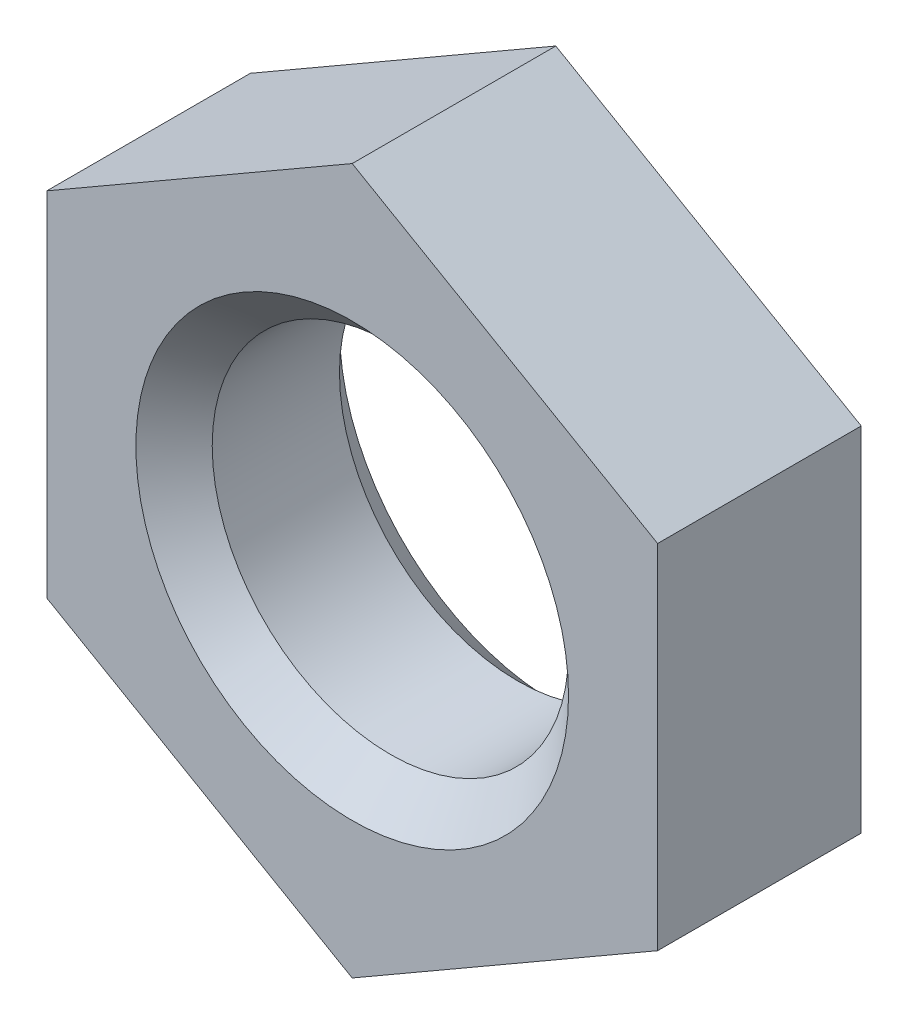
ISO-10303-21;
HEADER;
FILE_DESCRIPTION(('STEP AP214'),'2;1');
FILE_NAME('part.step','',(''),(''),'','','');
FILE_SCHEMA(('AUTOMOTIVE_DESIGN { 1 0 10303 214 1 1 1 1 }'));
ENDSEC;
DATA;
#1=APPLICATION_CONTEXT('core data for automotive mechanical design processes');
#2=APPLICATION_PROTOCOL_DEFINITION('international standard','automotive_design',2000,#1);
#3=PRODUCT_CONTEXT('',#1,'mechanical');
#4=PRODUCT('Part','Part','',(#3));
#5=PRODUCT_RELATED_PRODUCT_CATEGORY('part','',(#4));
#6=PRODUCT_DEFINITION_FORMATION('','',#4);
#7=PRODUCT_DEFINITION_CONTEXT('part definition',#1,'design');
#8=PRODUCT_DEFINITION('design','',#6,#7);
#9=PRODUCT_DEFINITION_SHAPE('','',#8);
#10=(LENGTH_UNIT() NAMED_UNIT(*) SI_UNIT(.MILLI.,.METRE.));
#11=(NAMED_UNIT(*) PLANE_ANGLE_UNIT() SI_UNIT($,.RADIAN.));
#12=(NAMED_UNIT(*) SI_UNIT($,.STERADIAN.) SOLID_ANGLE_UNIT());
#13=UNCERTAINTY_MEASURE_WITH_UNIT(LENGTH_MEASURE(1.E-05),#10,'distance_accuracy_value','');
#14=(GEOMETRIC_REPRESENTATION_CONTEXT(3) GLOBAL_UNCERTAINTY_ASSIGNED_CONTEXT((#13)) GLOBAL_UNIT_ASSIGNED_CONTEXT((#10,
#11,#12)) REPRESENTATION_CONTEXT('',''));
#15=CARTESIAN_POINT('',(0.,0.,0.));
#16=DIRECTION('',(0.,0.,1.));
#17=DIRECTION('',(1.,0.,0.));
#18=AXIS2_PLACEMENT_3D('',#15,#16,#17);
#19=CARTESIAN_POINT('',(0.,0.,0.));
#20=DIRECTION('',(0.,0.,1.));
#21=DIRECTION('',(1.,0.,0.));
#22=AXIS2_PLACEMENT_3D('',#19,#20,#21);
#23=PLANE('',#22);
#24=CARTESIAN_POINT('',(0.,0.,0.));
#25=DIRECTION('',(0.,0.,1.));
#26=DIRECTION('',(1.,0.,0.));
#27=AXIS2_PLACEMENT_3D('',#24,#25,#26);
#28=CIRCLE('',#27,8.50000000000001);
#29=CARTESIAN_POINT('',(-8.50000000000001,0.,0.));
#30=VERTEX_POINT('',#29);
#31=EDGE_CURVE('E11',#30,#30,#28,.T.);
#32=ORIENTED_EDGE('',*,*,#31,.T.);
#33=EDGE_LOOP('',(#32));
#34=FACE_BOUND('',#33,.T.);
#35=DIRECTION('',(-0.866025403784438,0.5,0.));
#36=VECTOR('',#35,1.);
#37=CARTESIAN_POINT('',(12.,6.92820323027551,0.));
#38=LINE('',#37,#36);
#39=CARTESIAN_POINT('',(12.,6.92820323027551,0.));
#40=VERTEX_POINT('',#39);
#41=CARTESIAN_POINT('',(0.,13.856406460551,0.));
#42=VERTEX_POINT('',#41);
#43=EDGE_CURVE('E136',#40,#42,#38,.T.);
#44=ORIENTED_EDGE('',*,*,#43,.F.);
#45=DIRECTION('',(0.,1.,0.));
#46=VECTOR('',#45,1.);
#47=CARTESIAN_POINT('',(12.,-6.92820323027551,0.));
#48=LINE('',#47,#46);
#49=CARTESIAN_POINT('',(12.,-6.92820323027551,0.));
#50=VERTEX_POINT('',#49);
#51=EDGE_CURVE('E96',#50,#40,#48,.T.);
#52=ORIENTED_EDGE('',*,*,#51,.F.);
#53=DIRECTION('',(0.866025403784439,0.5,0.));
#54=VECTOR('',#53,1.);
#55=CARTESIAN_POINT('',(0.,-13.856406460551,0.));
#56=LINE('',#55,#54);
#57=CARTESIAN_POINT('',(0.,-13.856406460551,0.));
#58=VERTEX_POINT('',#57);
#59=EDGE_CURVE('E90',#58,#50,#56,.T.);
#60=ORIENTED_EDGE('',*,*,#59,.F.);
#61=DIRECTION('',(0.866025403784439,-0.5,0.));
#62=VECTOR('',#61,1.);
#63=CARTESIAN_POINT('',(-12.,-6.9282032302755,0.));
#64=LINE('',#63,#62);
#65=CARTESIAN_POINT('',(-12.,-6.9282032302755,0.));
#66=VERTEX_POINT('',#65);
#67=EDGE_CURVE('E126',#66,#58,#64,.T.);
#68=ORIENTED_EDGE('',*,*,#67,.F.);
#69=DIRECTION('',(0.,-1.,0.));
#70=VECTOR('',#69,1.);
#71=CARTESIAN_POINT('',(-12.,6.92820323027551,0.));
#72=LINE('',#71,#70);
#73=CARTESIAN_POINT('',(-12.,6.92820323027551,0.));
#74=VERTEX_POINT('',#73);
#75=EDGE_CURVE('E141',#74,#66,#72,.T.);
#76=ORIENTED_EDGE('',*,*,#75,.F.);
#77=DIRECTION('',(-0.866025403784439,-0.5,0.));
#78=VECTOR('',#77,1.);
#79=CARTESIAN_POINT('',(0.,13.856406460551,0.));
#80=LINE('',#79,#78);
#81=EDGE_CURVE('E139',#42,#74,#80,.T.);
#82=ORIENTED_EDGE('',*,*,#81,.F.);
#83=EDGE_LOOP('',(#44,#52,#60,#68,#76,#82));
#84=FACE_BOUND('',#83,.T.);
#85=ADVANCED_FACE('F49',(#34,#84),#23,.F.);
#86=CARTESIAN_POINT('',(12.,6.92820323027551,8.));
#87=DIRECTION('',(-0.5,-0.866025403784438,0.));
#88=DIRECTION('',(0.866025403784438,-0.5,0.));
#89=AXIS2_PLACEMENT_3D('',#86,#87,#88);
#90=PLANE('',#89);
#91=ORIENTED_EDGE('',*,*,#43,.T.);
#92=DIRECTION('',(0.,0.,-1.));
#93=VECTOR('',#92,1.);
#94=CARTESIAN_POINT('',(0.,13.856406460551,8.));
#95=LINE('',#94,#93);
#96=CARTESIAN_POINT('',(0.,13.856406460551,8.));
#97=VERTEX_POINT('',#96);
#98=EDGE_CURVE('E153',#97,#42,#95,.T.);
#99=ORIENTED_EDGE('',*,*,#98,.F.);
#100=DIRECTION('',(-0.866025403784438,0.5,0.));
#101=VECTOR('',#100,1.);
#102=CARTESIAN_POINT('',(12.,6.92820323027551,8.));
#103=LINE('',#102,#101);
#104=CARTESIAN_POINT('',(12.,6.92820323027551,8.));
#105=VERTEX_POINT('',#104);
#106=EDGE_CURVE('E146',#105,#97,#103,.T.);
#107=ORIENTED_EDGE('',*,*,#106,.F.);
#108=DIRECTION('',(0.,0.,-1.));
#109=VECTOR('',#108,1.);
#110=CARTESIAN_POINT('',(12.,6.92820323027551,8.));
#111=LINE('',#110,#109);
#112=EDGE_CURVE('E132',#105,#40,#111,.T.);
#113=ORIENTED_EDGE('',*,*,#112,.T.);
#114=EDGE_LOOP('',(#91,#99,#107,#113));
#115=FACE_BOUND('',#114,.T.);
#116=ADVANCED_FACE('F181',(#115),#90,.F.);
#117=CARTESIAN_POINT('',(0.,13.856406460551,8.));
#118=DIRECTION('',(0.5,-0.866025403784439,0.));
#119=DIRECTION('',(0.866025403784439,0.5,0.));
#120=AXIS2_PLACEMENT_3D('',#117,#118,#119);
#121=PLANE('',#120);
#122=ORIENTED_EDGE('',*,*,#81,.T.);
#123=DIRECTION('',(0.,0.,-1.));
#124=VECTOR('',#123,1.);
#125=CARTESIAN_POINT('',(-12.,6.92820323027551,8.));
#126=LINE('',#125,#124);
#127=CARTESIAN_POINT('',(-12.,6.92820323027551,8.));
#128=VERTEX_POINT('',#127);
#129=EDGE_CURVE('E150',#128,#74,#126,.T.);
#130=ORIENTED_EDGE('',*,*,#129,.F.);
#131=DIRECTION('',(-0.866025403784439,-0.5,0.));
#132=VECTOR('',#131,1.);
#133=CARTESIAN_POINT('',(0.,13.856406460551,8.));
#134=LINE('',#133,#132);
#135=EDGE_CURVE('E105',#97,#128,#134,.T.);
#136=ORIENTED_EDGE('',*,*,#135,.F.);
#137=ORIENTED_EDGE('',*,*,#98,.T.);
#138=EDGE_LOOP('',(#122,#130,#136,#137));
#139=FACE_BOUND('',#138,.T.);
#140=ADVANCED_FACE('F189',(#139),#121,.F.);
#141=CARTESIAN_POINT('',(-12.,6.92820323027551,8.));
#142=DIRECTION('',(1.,0.,0.));
#143=DIRECTION('',(0.,1.,0.));
#144=AXIS2_PLACEMENT_3D('',#141,#142,#143);
#145=PLANE('',#144);
#146=ORIENTED_EDGE('',*,*,#75,.T.);
#147=DIRECTION('',(0.,0.,-1.));
#148=VECTOR('',#147,1.);
#149=CARTESIAN_POINT('',(-12.,-6.9282032302755,8.));
#150=LINE('',#149,#148);
#151=CARTESIAN_POINT('',(-12.,-6.9282032302755,8.));
#152=VERTEX_POINT('',#151);
#153=EDGE_CURVE('E127',#152,#66,#150,.T.);
#154=ORIENTED_EDGE('',*,*,#153,.F.);
#155=DIRECTION('',(0.,-1.,0.));
#156=VECTOR('',#155,1.);
#157=CARTESIAN_POINT('',(-12.,6.92820323027551,8.));
#158=LINE('',#157,#156);
#159=EDGE_CURVE('E118',#128,#152,#158,.T.);
#160=ORIENTED_EDGE('',*,*,#159,.F.);
#161=ORIENTED_EDGE('',*,*,#129,.T.);
#162=EDGE_LOOP('',(#146,#154,#160,#161));
#163=FACE_BOUND('',#162,.T.);
#164=ADVANCED_FACE('F201',(#163),#145,.F.);
#165=CARTESIAN_POINT('',(-12.,-6.9282032302755,8.));
#166=DIRECTION('',(0.5,0.866025403784439,0.));
#167=DIRECTION('',(-0.866025403784439,0.5,0.));
#168=AXIS2_PLACEMENT_3D('',#165,#166,#167);
#169=PLANE('',#168);
#170=ORIENTED_EDGE('',*,*,#67,.T.);
#171=DIRECTION('',(0.,0.,-1.));
#172=VECTOR('',#171,1.);
#173=CARTESIAN_POINT('',(0.,-13.856406460551,8.));
#174=LINE('',#173,#172);
#175=CARTESIAN_POINT('',(0.,-13.856406460551,8.));
#176=VERTEX_POINT('',#175);
#177=EDGE_CURVE('E123',#176,#58,#174,.T.);
#178=ORIENTED_EDGE('',*,*,#177,.F.);
#179=DIRECTION('',(0.866025403784439,-0.5,0.));
#180=VECTOR('',#179,1.);
#181=CARTESIAN_POINT('',(-12.,-6.9282032302755,8.));
#182=LINE('',#181,#180);
#183=EDGE_CURVE('E112',#152,#176,#182,.T.);
#184=ORIENTED_EDGE('',*,*,#183,.F.);
#185=ORIENTED_EDGE('',*,*,#153,.T.);
#186=EDGE_LOOP('',(#170,#178,#184,#185));
#187=FACE_BOUND('',#186,.T.);
#188=ADVANCED_FACE('F124',(#187),#169,.F.);
#189=CARTESIAN_POINT('',(0.,-13.856406460551,8.));
#190=DIRECTION('',(-0.5,0.866025403784439,0.));
#191=DIRECTION('',(-0.866025403784439,-0.5,0.));
#192=AXIS2_PLACEMENT_3D('',#189,#190,#191);
#193=PLANE('',#192);
#194=ORIENTED_EDGE('',*,*,#59,.T.);
#195=DIRECTION('',(0.,0.,-1.));
#196=VECTOR('',#195,1.);
#197=CARTESIAN_POINT('',(12.,-6.92820323027551,8.));
#198=LINE('',#197,#196);
#199=CARTESIAN_POINT('',(12.,-6.92820323027551,8.));
#200=VERTEX_POINT('',#199);
#201=EDGE_CURVE('E128',#200,#50,#198,.T.);
#202=ORIENTED_EDGE('',*,*,#201,.F.);
#203=DIRECTION('',(0.866025403784439,0.5,0.));
#204=VECTOR('',#203,1.);
#205=CARTESIAN_POINT('',(0.,-13.856406460551,8.));
#206=LINE('',#205,#204);
#207=EDGE_CURVE('E116',#176,#200,#206,.T.);
#208=ORIENTED_EDGE('',*,*,#207,.F.);
#209=ORIENTED_EDGE('',*,*,#177,.T.);
#210=EDGE_LOOP('',(#194,#202,#208,#209));
#211=FACE_BOUND('',#210,.T.);
#212=ADVANCED_FACE('F130',(#211),#193,.F.);
#213=CARTESIAN_POINT('',(12.,-6.92820323027551,8.));
#214=DIRECTION('',(-1.,0.,0.));
#215=DIRECTION('',(0.,-1.,0.));
#216=AXIS2_PLACEMENT_3D('',#213,#214,#215);
#217=PLANE('',#216);
#218=ORIENTED_EDGE('',*,*,#51,.T.);
#219=ORIENTED_EDGE('',*,*,#112,.F.);
#220=DIRECTION('',(0.,1.,0.));
#221=VECTOR('',#220,1.);
#222=CARTESIAN_POINT('',(12.,-6.92820323027551,8.));
#223=LINE('',#222,#221);
#224=EDGE_CURVE('E67',#200,#105,#223,.T.);
#225=ORIENTED_EDGE('',*,*,#224,.F.);
#226=ORIENTED_EDGE('',*,*,#201,.T.);
#227=EDGE_LOOP('',(#218,#219,#225,#226));
#228=FACE_BOUND('',#227,.T.);
#229=ADVANCED_FACE('F195',(#228),#217,.F.);
#230=CARTESIAN_POINT('',(0.,0.,8.));
#231=DIRECTION('',(0.,0.,1.));
#232=DIRECTION('',(1.,0.,0.));
#233=AXIS2_PLACEMENT_3D('',#230,#231,#232);
#234=PLANE('',#233);
#235=CARTESIAN_POINT('',(0.,0.,8.));
#236=DIRECTION('',(0.,0.,1.));
#237=DIRECTION('',(1.,0.,0.));
#238=AXIS2_PLACEMENT_3D('',#235,#236,#237);
#239=CIRCLE('',#238,8.50000000000002);
#240=CARTESIAN_POINT('',(8.50000000000002,0.,8.));
#241=VERTEX_POINT('',#240);
#242=EDGE_CURVE('E59',#241,#241,#239,.F.);
#243=ORIENTED_EDGE('',*,*,#242,.T.);
#244=EDGE_LOOP('',(#243));
#245=FACE_BOUND('',#244,.T.);
#246=ORIENTED_EDGE('',*,*,#106,.T.);
#247=ORIENTED_EDGE('',*,*,#135,.T.);
#248=ORIENTED_EDGE('',*,*,#159,.T.);
#249=ORIENTED_EDGE('',*,*,#183,.T.);
#250=ORIENTED_EDGE('',*,*,#207,.T.);
#251=ORIENTED_EDGE('',*,*,#224,.T.);
#252=EDGE_LOOP('',(#246,#247,#248,#249,#250,#251));
#253=FACE_BOUND('',#252,.T.);
#254=ADVANCED_FACE('F114',(#245,#253),#234,.T.);
#255=CARTESIAN_POINT('',(0.,0.,0.));
#256=DIRECTION('',(0.,0.,-1.));
#257=DIRECTION('',(-1.,0.,0.));
#258=AXIS2_PLACEMENT_3D('',#255,#256,#257);
#259=CYLINDRICAL_SURFACE('',#258,7.);
#260=CARTESIAN_POINT('',(0.,0.,6.49999999999999));
#261=DIRECTION('',(0.,0.,1.));
#262=DIRECTION('',(1.,0.,0.));
#263=AXIS2_PLACEMENT_3D('',#260,#261,#262);
#264=CIRCLE('',#263,7.);
#265=CARTESIAN_POINT('',(7.,0.,6.49999999999999));
#266=VERTEX_POINT('',#265);
#267=EDGE_CURVE('E158',#266,#266,#264,.T.);
#268=ORIENTED_EDGE('',*,*,#267,.T.);
#269=EDGE_LOOP('',(#268));
#270=FACE_BOUND('',#269,.T.);
#271=CARTESIAN_POINT('',(0.,0.,1.5));
#272=DIRECTION('',(0.,0.,1.));
#273=DIRECTION('',(1.,0.,0.));
#274=AXIS2_PLACEMENT_3D('',#271,#272,#273);
#275=CIRCLE('',#274,7.);
#276=CARTESIAN_POINT('',(-7.,0.,1.5));
#277=VERTEX_POINT('',#276);
#278=EDGE_CURVE('E155',#277,#277,#275,.F.);
#279=ORIENTED_EDGE('',*,*,#278,.T.);
#280=EDGE_LOOP('',(#279));
#281=FACE_BOUND('',#280,.T.);
#282=ADVANCED_FACE('F167',(#270,#281),#259,.F.);
#283=CARTESIAN_POINT('',(0.,0.,6.49999999999999));
#284=DIRECTION('',(0.,0.,1.));
#285=DIRECTION('',(1.,0.,0.));
#286=AXIS2_PLACEMENT_3D('',#283,#284,#285);
#287=CONICAL_SURFACE('',#286,7.,0.785398163397452);
#288=ORIENTED_EDGE('',*,*,#242,.F.);
#289=EDGE_LOOP('',(#288));
#290=FACE_BOUND('',#289,.T.);
#291=ORIENTED_EDGE('',*,*,#267,.F.);
#292=EDGE_LOOP('',(#291));
#293=FACE_BOUND('',#292,.T.);
#294=ADVANCED_FACE('F164',(#290,#293),#287,.F.);
#295=CARTESIAN_POINT('',(0.,0.,1.5));
#296=DIRECTION('',(0.,0.,-1.));
#297=DIRECTION('',(-1.,0.,0.));
#298=AXIS2_PLACEMENT_3D('',#295,#296,#297);
#299=CONICAL_SURFACE('',#298,7.,0.785398163397451);
#300=CARTESIAN_POINT('',(-8.50000000000001,0.,0.));
#301=CARTESIAN_POINT('',(-8.48437500000001,0.,0.0156249999999997));
#302=CARTESIAN_POINT('',(-8.46875000000001,0.,0.0312499999999998));
#303=CARTESIAN_POINT('',(-8.43750000000001,0.,0.0624999999999999));
#304=CARTESIAN_POINT('',(-8.42187500000001,0.,0.078125));
#305=CARTESIAN_POINT('',(-8.39062500000001,0.,0.109375));
#306=CARTESIAN_POINT('',(-8.37500000000001,0.,0.125));
#307=CARTESIAN_POINT('',(-8.34375000000001,0.,0.15625));
#308=CARTESIAN_POINT('',(-8.32812500000001,0.,0.171875));
#309=CARTESIAN_POINT('',(-8.29687500000001,0.,0.203125));
#310=CARTESIAN_POINT('',(-8.28125000000001,0.,0.21875));
#311=CARTESIAN_POINT('',(-8.25000000000001,0.,0.25));
#312=CARTESIAN_POINT('',(-8.23437500000001,0.,0.265625));
#313=CARTESIAN_POINT('',(-8.20312500000001,0.,0.296875000000001));
#314=CARTESIAN_POINT('',(-8.18750000000001,0.,0.3125));
#315=CARTESIAN_POINT('',(-8.15625000000001,0.,0.34375));
#316=CARTESIAN_POINT('',(-8.14062500000001,0.,0.359375));
#317=CARTESIAN_POINT('',(-8.10937500000001,0.,0.390625000000001));
#318=CARTESIAN_POINT('',(-8.09375000000001,0.,0.406250000000001));
#319=CARTESIAN_POINT('',(-8.06250000000001,0.,0.437500000000001));
#320=CARTESIAN_POINT('',(-8.04687500000001,0.,0.453125000000001));
#321=CARTESIAN_POINT('',(-8.01562500000001,0.,0.484375000000001));
#322=CARTESIAN_POINT('',(-8.00000000000001,0.,0.500000000000001));
#323=CARTESIAN_POINT('',(-7.96875000000001,0.,0.531250000000001));
#324=CARTESIAN_POINT('',(-7.95312500000001,0.,0.546875000000001));
#325=CARTESIAN_POINT('',(-7.92187500000001,0.,0.578125000000001));
#326=CARTESIAN_POINT('',(-7.90625000000001,0.,0.593750000000001));
#327=CARTESIAN_POINT('',(-7.87500000000001,0.,0.625000000000001));
#328=CARTESIAN_POINT('',(-7.85937500000001,0.,0.640625000000001));
#329=CARTESIAN_POINT('',(-7.82812500000001,0.,0.671875000000001));
#330=CARTESIAN_POINT('',(-7.81250000000001,0.,0.687500000000001));
#331=CARTESIAN_POINT('',(-7.78125000000001,0.,0.718750000000001));
#332=CARTESIAN_POINT('',(-7.76562500000001,0.,0.734375000000001));
#333=CARTESIAN_POINT('',(-7.73437500000001,0.,0.765625000000001));
#334=CARTESIAN_POINT('',(-7.71875000000001,0.,0.781250000000001));
#335=CARTESIAN_POINT('',(-7.68750000000001,0.,0.812500000000001));
#336=CARTESIAN_POINT('',(-7.67187500000001,0.,0.828125000000002));
#337=CARTESIAN_POINT('',(-7.64062500000001,0.,0.859375000000002));
#338=CARTESIAN_POINT('',(-7.625,0.,0.875000000000002));
#339=CARTESIAN_POINT('',(-7.59375,0.,0.906250000000002));
#340=CARTESIAN_POINT('',(-7.578125,0.,0.921875000000002));
#341=CARTESIAN_POINT('',(-7.546875,0.,0.953125000000002));
#342=CARTESIAN_POINT('',(-7.53125,0.,0.968750000000002));
#343=CARTESIAN_POINT('',(-7.5,0.,1.));
#344=CARTESIAN_POINT('',(-7.484375,0.,1.015625));
#345=CARTESIAN_POINT('',(-7.453125,0.,1.046875));
#346=CARTESIAN_POINT('',(-7.4375,0.,1.0625));
#347=CARTESIAN_POINT('',(-7.40625,0.,1.09375));
#348=CARTESIAN_POINT('',(-7.390625,0.,1.109375));
#349=CARTESIAN_POINT('',(-7.359375,0.,1.140625));
#350=CARTESIAN_POINT('',(-7.34375,0.,1.15625));
#351=CARTESIAN_POINT('',(-7.3125,0.,1.1875));
#352=CARTESIAN_POINT('',(-7.296875,0.,1.203125));
#353=CARTESIAN_POINT('',(-7.265625,0.,1.234375));
#354=CARTESIAN_POINT('',(-7.25,0.,1.25));
#355=CARTESIAN_POINT('',(-7.21875,0.,1.28125));
#356=CARTESIAN_POINT('',(-7.203125,0.,1.296875));
#357=CARTESIAN_POINT('',(-7.171875,0.,1.328125));
#358=CARTESIAN_POINT('',(-7.15625,0.,1.34375));
#359=CARTESIAN_POINT('',(-7.125,0.,1.375));
#360=CARTESIAN_POINT('',(-7.109375,0.,1.390625));
#361=CARTESIAN_POINT('',(-7.078125,0.,1.421875));
#362=CARTESIAN_POINT('',(-7.0625,0.,1.4375));
#363=CARTESIAN_POINT('',(-7.03125,0.,1.46875));
#364=CARTESIAN_POINT('',(-7.015625,0.,1.484375));
#365=CARTESIAN_POINT('',(-7.,0.,1.5));
#366=B_SPLINE_CURVE_WITH_KNOTS('',3,(#300,#301,#302,#303,#304,#305,#306,#307,#308,#309,#310,
#311,#312,#313,#314,#315,#316,#317,#318,#319,#320,#321,#322,#323,#324,#325,#326,#327,#328,#329,
#330,#331,#332,#333,#334,#335,#336,#337,#338,#339,#340,#341,#342,#343,#344,#345,#346,#347,#348,
#349,#350,#351,#352,#353,#354,#355,#356,#357,#358,#359,#360,#361,#362,#363,#364,#365),
.UNSPECIFIED.,.F.,.F.,(4,2,2,2,2,2,2,2,2,2,2,2,2,2,2,2,2,2,2,2,2,2,2,2,2,2,2,2,2,2,2,2,4),(0.,
0.0662912607362389,0.132582521472478,0.198873782208717,0.265165042944956,0.331456303681196,
0.397747564417435,0.464038825153674,0.530330085889913,0.596621346626152,0.662912607362392,
0.729203868098631,0.79549512883487,0.861786389571109,0.928077650307347,0.994368911043587,
1.06066017177983,1.12695143251607,1.1932426932523,1.25953395398854,1.32582521472478,
1.39211647546102,1.45840773619726,1.5246989969335,1.59099025766974,1.65728151840598,
1.72357277914222,1.78986403987846,1.8561553006147,1.92244656135094,1.98873782208717,
2.05502908282341,2.12132034355965),.UNSPECIFIED.);
#367=EDGE_CURVE('BSEAM52',#30,#277,#366,.T.);
#368=ORIENTED_EDGE('',*,*,#31,.F.);
#369=ORIENTED_EDGE('',*,*,#278,.F.);
#370=ORIENTED_EDGE('',*,*,#367,.T.);
#371=ORIENTED_EDGE('',*,*,#367,.F.);
#372=EDGE_LOOP('',(#368,#370,#369,#371));
#373=FACE_BOUND('',#372,.T.);
#374=ADVANCED_FACE('F52',(#373),#299,.F.);
#375=CLOSED_SHELL('',(#85,#116,#140,#164,#188,#212,#229,#254,#282,#294,#374));
#376=MANIFOLD_SOLID_BREP('B2',#375);
#377=ADVANCED_BREP_SHAPE_REPRESENTATION('',(#18,#376),#14);
#378=SHAPE_DEFINITION_REPRESENTATION(#9,#377);
ENDSEC;
END-ISO-10303-21;
